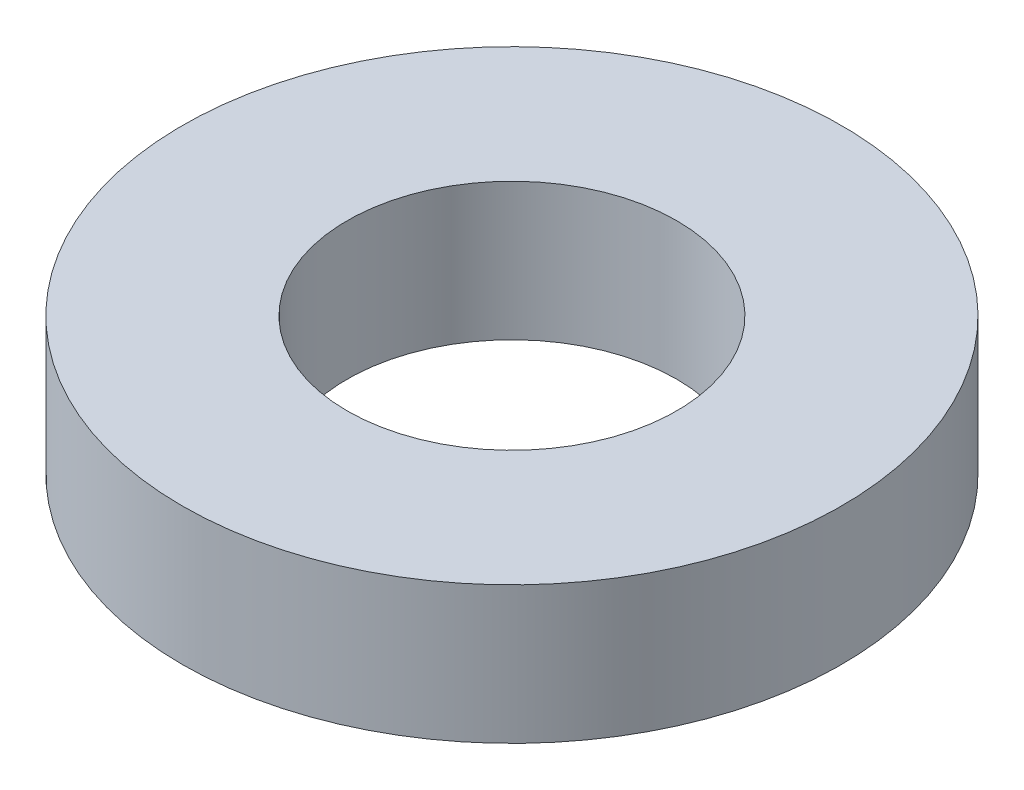
ISO-10303-21;
HEADER;
FILE_DESCRIPTION(('STEP AP214'),'2;1');
FILE_NAME('part.step','',(''),(''),'','','');
FILE_SCHEMA(('AUTOMOTIVE_DESIGN { 1 0 10303 214 1 1 1 1 }'));
ENDSEC;
DATA;
#1=APPLICATION_CONTEXT('core data for automotive mechanical design processes');
#2=APPLICATION_PROTOCOL_DEFINITION('international standard','automotive_design',2000,#1);
#3=PRODUCT_CONTEXT('',#1,'mechanical');
#4=PRODUCT('Part','Part','',(#3));
#5=PRODUCT_RELATED_PRODUCT_CATEGORY('part','',(#4));
#6=PRODUCT_DEFINITION_FORMATION('','',#4);
#7=PRODUCT_DEFINITION_CONTEXT('part definition',#1,'design');
#8=PRODUCT_DEFINITION('design','',#6,#7);
#9=PRODUCT_DEFINITION_SHAPE('','',#8);
#10=(LENGTH_UNIT() NAMED_UNIT(*) SI_UNIT(.MILLI.,.METRE.));
#11=(NAMED_UNIT(*) PLANE_ANGLE_UNIT() SI_UNIT($,.RADIAN.));
#12=(NAMED_UNIT(*) SI_UNIT($,.STERADIAN.) SOLID_ANGLE_UNIT());
#13=UNCERTAINTY_MEASURE_WITH_UNIT(LENGTH_MEASURE(1.E-05),#10,'distance_accuracy_value','');
#14=(GEOMETRIC_REPRESENTATION_CONTEXT(3) GLOBAL_UNCERTAINTY_ASSIGNED_CONTEXT((#13)) GLOBAL_UNIT_ASSIGNED_CONTEXT((#10,
#11,#12)) REPRESENTATION_CONTEXT('',''));
#15=CARTESIAN_POINT('',(0.,0.,0.));
#16=DIRECTION('',(0.,0.,1.));
#17=DIRECTION('',(1.,0.,0.));
#18=AXIS2_PLACEMENT_3D('',#15,#16,#17);
#19=CARTESIAN_POINT('',(0.,5.,0.));
#20=DIRECTION('',(0.,1.,0.));
#21=DIRECTION('',(0.,0.,1.));
#22=AXIS2_PLACEMENT_3D('',#19,#20,#21);
#23=PLANE('',#22);
#24=CARTESIAN_POINT('',(0.,5.,0.));
#25=DIRECTION('',(0.,1.,0.));
#26=DIRECTION('',(0.,0.,1.));
#27=AXIS2_PLACEMENT_3D('',#24,#25,#26);
#28=CIRCLE('',#27,12.);
#29=CARTESIAN_POINT('',(0.,5.,12.));
#30=VERTEX_POINT('',#29);
#31=EDGE_CURVE('E10',#30,#30,#28,.T.);
#32=ORIENTED_EDGE('',*,*,#31,.T.);
#33=EDGE_LOOP('',(#32));
#34=FACE_BOUND('',#33,.T.);
#35=CARTESIAN_POINT('',(0.,5.,0.));
#36=DIRECTION('',(0.,1.,0.));
#37=DIRECTION('',(0.,0.,1.));
#38=AXIS2_PLACEMENT_3D('',#35,#36,#37);
#39=CIRCLE('',#38,6.);
#40=CARTESIAN_POINT('',(0.,5.,6.));
#41=VERTEX_POINT('',#40);
#42=EDGE_CURVE('E52',#41,#41,#39,.T.);
#43=ORIENTED_EDGE('',*,*,#42,.F.);
#44=EDGE_LOOP('',(#43));
#45=FACE_BOUND('',#44,.T.);
#46=ADVANCED_FACE('F39',(#34,#45),#23,.T.);
#47=CARTESIAN_POINT('',(0.,0.,0.));
#48=DIRECTION('',(0.,1.,0.));
#49=DIRECTION('',(0.,0.,1.));
#50=AXIS2_PLACEMENT_3D('',#47,#48,#49);
#51=PLANE('',#50);
#52=CARTESIAN_POINT('',(0.,0.,0.));
#53=DIRECTION('',(0.,1.,0.));
#54=DIRECTION('',(0.,0.,1.));
#55=AXIS2_PLACEMENT_3D('',#52,#53,#54);
#56=CIRCLE('',#55,12.);
#57=CARTESIAN_POINT('',(0.,0.,12.));
#58=VERTEX_POINT('',#57);
#59=EDGE_CURVE('E43',#58,#58,#56,.T.);
#60=ORIENTED_EDGE('',*,*,#59,.F.);
#61=EDGE_LOOP('',(#60));
#62=FACE_BOUND('',#61,.T.);
#63=CARTESIAN_POINT('',(0.,0.,0.));
#64=DIRECTION('',(0.,1.,0.));
#65=DIRECTION('',(0.,0.,1.));
#66=AXIS2_PLACEMENT_3D('',#63,#64,#65);
#67=CIRCLE('',#66,6.);
#68=CARTESIAN_POINT('',(0.,0.,6.));
#69=VERTEX_POINT('',#68);
#70=EDGE_CURVE('E54',#69,#69,#67,.T.);
#71=ORIENTED_EDGE('',*,*,#70,.T.);
#72=EDGE_LOOP('',(#71));
#73=FACE_BOUND('',#72,.T.);
#74=ADVANCED_FACE('F66',(#62,#73),#51,.F.);
#75=CARTESIAN_POINT('',(0.,5.,0.));
#76=DIRECTION('',(0.,-1.,0.));
#77=DIRECTION('',(0.,0.,-1.));
#78=AXIS2_PLACEMENT_3D('',#75,#76,#77);
#79=CYLINDRICAL_SURFACE('',#78,12.);
#80=ORIENTED_EDGE('',*,*,#31,.F.);
#81=EDGE_LOOP('',(#80));
#82=FACE_BOUND('',#81,.T.);
#83=ORIENTED_EDGE('',*,*,#59,.T.);
#84=EDGE_LOOP('',(#83));
#85=FACE_BOUND('',#84,.T.);
#86=ADVANCED_FACE('F41',(#82,#85),#79,.T.);
#87=CARTESIAN_POINT('',(0.,5.,0.));
#88=DIRECTION('',(0.,-1.,0.));
#89=DIRECTION('',(0.,0.,-1.));
#90=AXIS2_PLACEMENT_3D('',#87,#88,#89);
#91=CYLINDRICAL_SURFACE('',#90,6.);
#92=ORIENTED_EDGE('',*,*,#42,.T.);
#93=EDGE_LOOP('',(#92));
#94=FACE_BOUND('',#93,.T.);
#95=ORIENTED_EDGE('',*,*,#70,.F.);
#96=EDGE_LOOP('',(#95));
#97=FACE_BOUND('',#96,.T.);
#98=ADVANCED_FACE('F62',(#94,#97),#91,.F.);
#99=CLOSED_SHELL('',(#46,#74,#86,#98));
#100=MANIFOLD_SOLID_BREP('B2',#99);
#101=ADVANCED_BREP_SHAPE_REPRESENTATION('',(#18,#100),#14);
#102=SHAPE_DEFINITION_REPRESENTATION(#9,#101);
ENDSEC;
END-ISO-10303-21;
